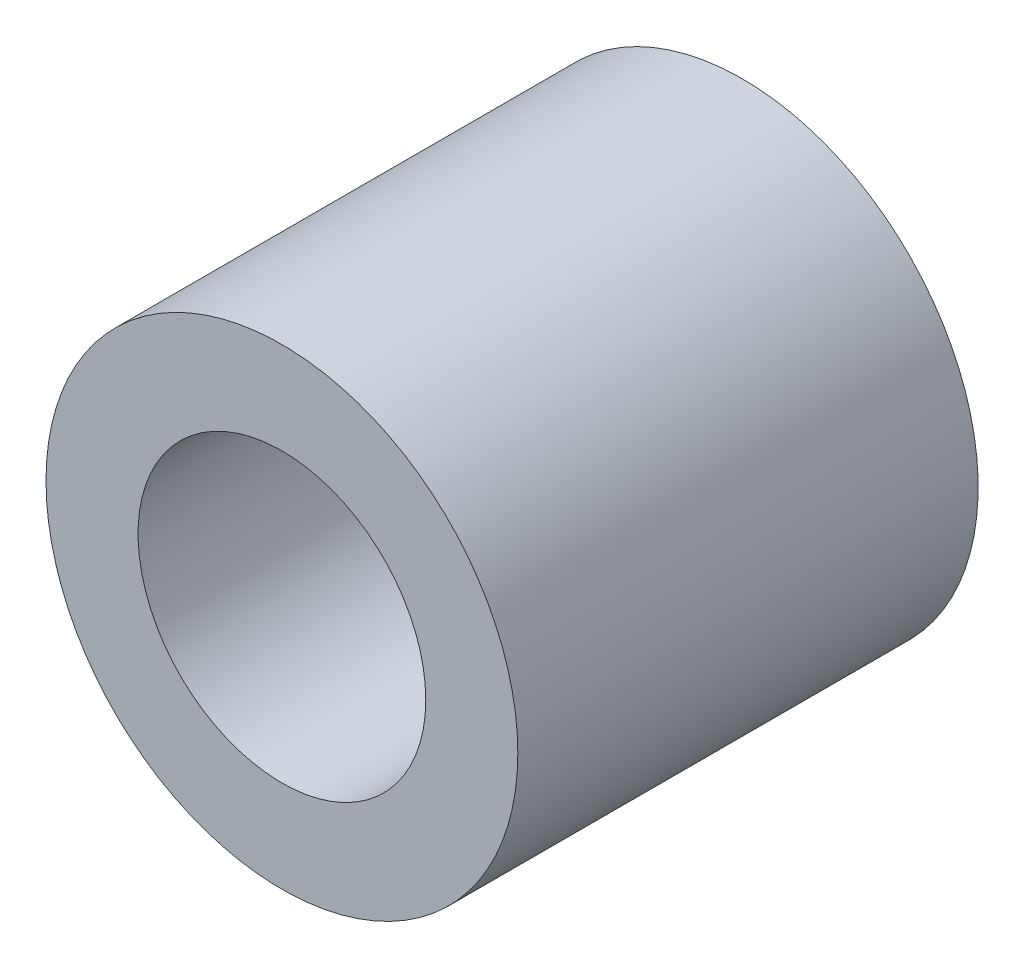
ISO-10303-21;
HEADER;
FILE_DESCRIPTION(('STEP AP214'),'2;1');
FILE_NAME('part.step','',(''),(''),'','','');
FILE_SCHEMA(('AUTOMOTIVE_DESIGN { 1 0 10303 214 1 1 1 1 }'));
ENDSEC;
DATA;
#1=APPLICATION_CONTEXT('core data for automotive mechanical design processes');
#2=APPLICATION_PROTOCOL_DEFINITION('international standard','automotive_design',2000,#1);
#3=PRODUCT_CONTEXT('',#1,'mechanical');
#4=PRODUCT('Part','Part','',(#3));
#5=PRODUCT_RELATED_PRODUCT_CATEGORY('part','',(#4));
#6=PRODUCT_DEFINITION_FORMATION('','',#4);
#7=PRODUCT_DEFINITION_CONTEXT('part definition',#1,'design');
#8=PRODUCT_DEFINITION('design','',#6,#7);
#9=PRODUCT_DEFINITION_SHAPE('','',#8);
#10=(LENGTH_UNIT() NAMED_UNIT(*) SI_UNIT(.MILLI.,.METRE.));
#11=(NAMED_UNIT(*) PLANE_ANGLE_UNIT() SI_UNIT($,.RADIAN.));
#12=(NAMED_UNIT(*) SI_UNIT($,.STERADIAN.) SOLID_ANGLE_UNIT());
#13=UNCERTAINTY_MEASURE_WITH_UNIT(LENGTH_MEASURE(1.E-05),#10,'distance_accuracy_value','');
#14=(GEOMETRIC_REPRESENTATION_CONTEXT(3) GLOBAL_UNCERTAINTY_ASSIGNED_CONTEXT((#13)) GLOBAL_UNIT_ASSIGNED_CONTEXT((#10,
#11,#12)) REPRESENTATION_CONTEXT('',''));
#15=CARTESIAN_POINT('',(0.,0.,0.));
#16=DIRECTION('',(0.,0.,1.));
#17=DIRECTION('',(1.,0.,0.));
#18=AXIS2_PLACEMENT_3D('',#15,#16,#17);
#19=CARTESIAN_POINT('',(0.,0.,10.));
#20=DIRECTION('',(0.,0.,1.));
#21=DIRECTION('',(1.,0.,0.));
#22=AXIS2_PLACEMENT_3D('',#19,#20,#21);
#23=PLANE('',#22);
#24=CARTESIAN_POINT('',(0.,0.,10.));
#25=DIRECTION('',(0.,0.,1.));
#26=DIRECTION('',(1.,0.,0.));
#27=AXIS2_PLACEMENT_3D('',#24,#25,#26);
#28=CIRCLE('',#27,10.25);
#29=CARTESIAN_POINT('',(10.25,0.,10.));
#30=VERTEX_POINT('',#29);
#31=EDGE_CURVE('E10',#30,#30,#28,.T.);
#32=ORIENTED_EDGE('',*,*,#31,.T.);
#33=EDGE_LOOP('',(#32));
#34=FACE_BOUND('',#33,.T.);
#35=CARTESIAN_POINT('',(0.,0.,10.));
#36=DIRECTION('',(0.,0.,1.));
#37=DIRECTION('',(1.,0.,0.));
#38=AXIS2_PLACEMENT_3D('',#35,#36,#37);
#39=CIRCLE('',#38,6.25);
#40=CARTESIAN_POINT('',(6.25,0.,10.));
#41=VERTEX_POINT('',#40);
#42=EDGE_CURVE('E45',#41,#41,#39,.T.);
#43=ORIENTED_EDGE('',*,*,#42,.F.);
#44=EDGE_LOOP('',(#43));
#45=FACE_BOUND('',#44,.T.);
#46=ADVANCED_FACE('F37',(#34,#45),#23,.T.);
#47=CARTESIAN_POINT('',(0.,0.,10.));
#48=DIRECTION('',(0.,0.,-1.));
#49=DIRECTION('',(-1.,0.,0.));
#50=AXIS2_PLACEMENT_3D('',#47,#48,#49);
#51=CYLINDRICAL_SURFACE('',#50,10.25);
#52=ORIENTED_EDGE('',*,*,#31,.F.);
#53=EDGE_LOOP('',(#52));
#54=FACE_BOUND('',#53,.T.);
#55=CARTESIAN_POINT('',(0.,0.,-10.));
#56=DIRECTION('',(0.,0.,-1.));
#57=DIRECTION('',(-1.,0.,0.));
#58=AXIS2_PLACEMENT_3D('',#55,#56,#57);
#59=CIRCLE('',#58,10.25);
#60=CARTESIAN_POINT('',(-10.25,0.,-10.));
#61=VERTEX_POINT('',#60);
#62=EDGE_CURVE('E56',#61,#61,#59,.T.);
#63=ORIENTED_EDGE('',*,*,#62,.F.);
#64=EDGE_LOOP('',(#63));
#65=FACE_BOUND('',#64,.T.);
#66=ADVANCED_FACE('F39',(#54,#65),#51,.T.);
#67=CARTESIAN_POINT('',(0.,0.,10.));
#68=DIRECTION('',(0.,0.,-1.));
#69=DIRECTION('',(-1.,0.,0.));
#70=AXIS2_PLACEMENT_3D('',#67,#68,#69);
#71=CYLINDRICAL_SURFACE('',#70,6.25);
#72=ORIENTED_EDGE('',*,*,#42,.T.);
#73=EDGE_LOOP('',(#72));
#74=FACE_BOUND('',#73,.T.);
#75=CARTESIAN_POINT('',(0.,0.,0.));
#76=DIRECTION('',(0.,0.,1.));
#77=DIRECTION('',(1.,0.,0.));
#78=AXIS2_PLACEMENT_3D('',#75,#76,#77);
#79=CIRCLE('',#78,6.25);
#80=CARTESIAN_POINT('',(6.25,0.,0.));
#81=VERTEX_POINT('',#80);
#82=EDGE_CURVE('E50',#81,#81,#79,.T.);
#83=ORIENTED_EDGE('',*,*,#82,.F.);
#84=EDGE_LOOP('',(#83));
#85=FACE_BOUND('',#84,.T.);
#86=ADVANCED_FACE('F83',(#74,#85),#71,.F.);
#87=CARTESIAN_POINT('',(0.,0.,0.));
#88=DIRECTION('',(0.,0.,-1.));
#89=DIRECTION('',(-1.,0.,0.));
#90=AXIS2_PLACEMENT_3D('',#87,#88,#89);
#91=PLANE('',#90);
#92=CARTESIAN_POINT('',(0.,0.,0.));
#93=DIRECTION('',(0.,0.,-1.));
#94=DIRECTION('',(-1.,0.,0.));
#95=AXIS2_PLACEMENT_3D('',#92,#93,#94);
#96=CIRCLE('',#95,4.);
#97=CARTESIAN_POINT('',(-4.,0.,0.));
#98=VERTEX_POINT('',#97);
#99=EDGE_CURVE('E62',#98,#98,#96,.T.);
#100=ORIENTED_EDGE('',*,*,#99,.T.);
#101=EDGE_LOOP('',(#100));
#102=FACE_BOUND('',#101,.T.);
#103=ORIENTED_EDGE('',*,*,#82,.T.);
#104=EDGE_LOOP('',(#103));
#105=FACE_BOUND('',#104,.T.);
#106=ADVANCED_FACE('F75',(#102,#105),#91,.F.);
#107=CARTESIAN_POINT('',(0.,0.,-10.));
#108=DIRECTION('',(0.,0.,-1.));
#109=DIRECTION('',(-1.,0.,0.));
#110=AXIS2_PLACEMENT_3D('',#107,#108,#109);
#111=PLANE('',#110);
#112=ORIENTED_EDGE('',*,*,#62,.T.);
#113=EDGE_LOOP('',(#112));
#114=FACE_BOUND('',#113,.T.);
#115=CARTESIAN_POINT('',(0.,0.,-10.));
#116=DIRECTION('',(0.,0.,-1.));
#117=DIRECTION('',(-1.,0.,0.));
#118=AXIS2_PLACEMENT_3D('',#115,#116,#117);
#119=CIRCLE('',#118,4.);
#120=CARTESIAN_POINT('',(-4.,0.,-10.));
#121=VERTEX_POINT('',#120);
#122=EDGE_CURVE('E61',#121,#121,#119,.T.);
#123=ORIENTED_EDGE('',*,*,#122,.F.);
#124=EDGE_LOOP('',(#123));
#125=FACE_BOUND('',#124,.T.);
#126=ADVANCED_FACE('F73',(#114,#125),#111,.T.);
#127=CARTESIAN_POINT('',(0.,0.,-10.));
#128=DIRECTION('',(0.,0.,1.));
#129=DIRECTION('',(1.,0.,0.));
#130=AXIS2_PLACEMENT_3D('',#127,#128,#129);
#131=CYLINDRICAL_SURFACE('',#130,4.);
#132=ORIENTED_EDGE('',*,*,#122,.T.);
#133=EDGE_LOOP('',(#132));
#134=FACE_BOUND('',#133,.T.);
#135=ORIENTED_EDGE('',*,*,#99,.F.);
#136=EDGE_LOOP('',(#135));
#137=FACE_BOUND('',#136,.T.);
#138=ADVANCED_FACE('F70',(#134,#137),#131,.F.);
#139=CLOSED_SHELL('',(#46,#66,#86,#106,#126,#138));
#140=MANIFOLD_SOLID_BREP('B2',#139);
#141=ADVANCED_BREP_SHAPE_REPRESENTATION('',(#18,#140),#14);
#142=SHAPE_DEFINITION_REPRESENTATION(#9,#141);
ENDSEC;
END-ISO-10303-21;
